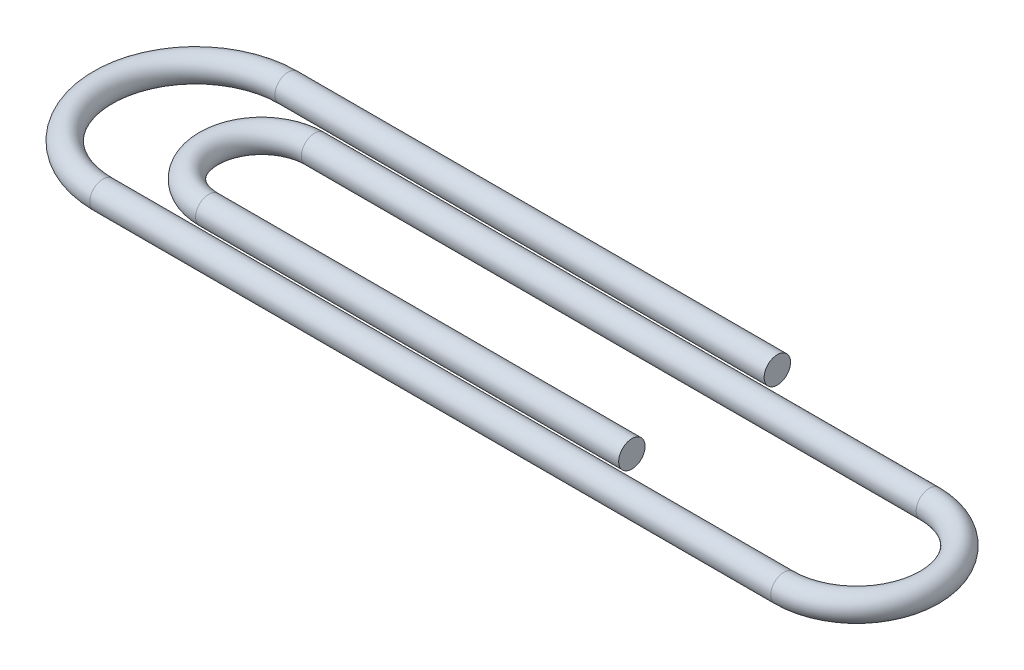
ISO-10303-21;
HEADER;
FILE_DESCRIPTION(('STEP AP214'),'2;1');
FILE_NAME('part.step','',(''),(''),'','','');
FILE_SCHEMA(('AUTOMOTIVE_DESIGN { 1 0 10303 214 1 1 1 1 }'));
ENDSEC;
DATA;
#1=APPLICATION_CONTEXT('core data for automotive mechanical design processes');
#2=APPLICATION_PROTOCOL_DEFINITION('international standard','automotive_design',2000,#1);
#3=PRODUCT_CONTEXT('',#1,'mechanical');
#4=PRODUCT('Part','Part','',(#3));
#5=PRODUCT_RELATED_PRODUCT_CATEGORY('part','',(#4));
#6=PRODUCT_DEFINITION_FORMATION('','',#4);
#7=PRODUCT_DEFINITION_CONTEXT('part definition',#1,'design');
#8=PRODUCT_DEFINITION('design','',#6,#7);
#9=PRODUCT_DEFINITION_SHAPE('','',#8);
#10=(LENGTH_UNIT() NAMED_UNIT(*) SI_UNIT(.MILLI.,.METRE.));
#11=(NAMED_UNIT(*) PLANE_ANGLE_UNIT() SI_UNIT($,.RADIAN.));
#12=(NAMED_UNIT(*) SI_UNIT($,.STERADIAN.) SOLID_ANGLE_UNIT());
#13=UNCERTAINTY_MEASURE_WITH_UNIT(LENGTH_MEASURE(1.E-05),#10,'distance_accuracy_value','');
#14=(GEOMETRIC_REPRESENTATION_CONTEXT(3) GLOBAL_UNCERTAINTY_ASSIGNED_CONTEXT((#13)) GLOBAL_UNIT_ASSIGNED_CONTEXT((#10,
#11,#12)) REPRESENTATION_CONTEXT('',''));
#15=CARTESIAN_POINT('',(0.,0.,0.));
#16=DIRECTION('',(0.,0.,1.));
#17=DIRECTION('',(1.,0.,0.));
#18=AXIS2_PLACEMENT_3D('',#15,#16,#17);
#19=CARTESIAN_POINT('',(0.,0.,0.));
#20=DIRECTION('',(1.,0.,0.));
#21=DIRECTION('',(0.,0.,-1.));
#22=AXIS2_PLACEMENT_3D('',#19,#20,#21);
#23=PLANE('',#22);
#24=CARTESIAN_POINT('',(0.,0.,0.));
#25=DIRECTION('',(1.,0.,0.));
#26=DIRECTION('',(0.,0.,-1.));
#27=AXIS2_PLACEMENT_3D('',#24,#25,#26);
#28=CIRCLE('',#27,0.5);
#29=CARTESIAN_POINT('',(0.,0.,-0.5));
#30=VERTEX_POINT('',#29);
#31=EDGE_CURVE('E72',#30,#30,#28,.T.);
#32=ORIENTED_EDGE('',*,*,#31,.T.);
#33=EDGE_LOOP('',(#32));
#34=FACE_BOUND('',#33,.T.);
#35=ADVANCED_FACE('F37',(#34),#23,.T.);
#36=CARTESIAN_POINT('',(0.,0.,-5.5));
#37=DIRECTION('',(-1.,0.,0.));
#38=DIRECTION('',(0.,0.,1.));
#39=AXIS2_PLACEMENT_3D('',#36,#37,#38);
#40=PLANE('',#39);
#41=CARTESIAN_POINT('',(0.,0.,-5.5));
#42=DIRECTION('',(-1.,0.,0.));
#43=DIRECTION('',(0.,0.,1.));
#44=AXIS2_PLACEMENT_3D('',#41,#42,#43);
#45=CIRCLE('',#44,0.5);
#46=CARTESIAN_POINT('',(0.,0.,-5.));
#47=VERTEX_POINT('',#46);
#48=EDGE_CURVE('E10',#47,#47,#45,.T.);
#49=ORIENTED_EDGE('',*,*,#48,.F.);
#50=EDGE_LOOP('',(#49));
#51=FACE_BOUND('',#50,.T.);
#52=ADVANCED_FACE('F81',(#51),#40,.F.);
#53=CARTESIAN_POINT('',(0.,0.,0.));
#54=DIRECTION('',(-1.,0.,0.));
#55=DIRECTION('',(0.,0.,1.));
#56=AXIS2_PLACEMENT_3D('',#53,#54,#55);
#57=CYLINDRICAL_SURFACE('',#56,0.5);
#58=CARTESIAN_POINT('',(-16.,0.,0.));
#59=DIRECTION('',(1.,0.,0.));
#60=DIRECTION('',(0.,0.,-1.));
#61=AXIS2_PLACEMENT_3D('',#58,#59,#60);
#62=CIRCLE('',#61,0.5);
#63=CARTESIAN_POINT('',(-16.,0.,0.500000000000002));
#64=VERTEX_POINT('',#63);
#65=EDGE_CURVE('E68',#64,#64,#62,.T.);
#66=ORIENTED_EDGE('',*,*,#65,.T.);
#67=EDGE_LOOP('',(#66));
#68=FACE_BOUND('',#67,.T.);
#69=ORIENTED_EDGE('',*,*,#31,.F.);
#70=EDGE_LOOP('',(#69));
#71=FACE_BOUND('',#70,.T.);
#72=ADVANCED_FACE('F78',(#68,#71),#57,.T.);
#73=CARTESIAN_POINT('',(-16.,0.,-2.));
#74=DIRECTION('',(0.,-1.,0.));
#75=DIRECTION('',(0.,0.,-1.));
#76=AXIS2_PLACEMENT_3D('',#73,#74,#75);
#77=TOROIDAL_SURFACE('',#76,2.,0.5);
#78=CARTESIAN_POINT('',(-16.,0.,-4.));
#79=DIRECTION('',(-1.,0.,0.));
#80=DIRECTION('',(0.,0.,1.));
#81=AXIS2_PLACEMENT_3D('',#78,#79,#80);
#82=CIRCLE('',#81,0.5);
#83=CARTESIAN_POINT('',(-16.,0.,-4.5));
#84=VERTEX_POINT('',#83);
#85=EDGE_CURVE('E64',#84,#84,#82,.T.);
#86=CARTESIAN_POINT('',(-16.,0.,-2.));
#87=DIRECTION('',(0.,-1.,0.));
#88=DIRECTION('',(0.,0.,-1.));
#89=AXIS2_PLACEMENT_3D('',#86,#87,#88);
#90=CIRCLE('',#89,2.5);
#91=EDGE_CURVE('',#64,#84,#90,.T.);
#92=ORIENTED_EDGE('',*,*,#65,.F.);
#93=ORIENTED_EDGE('',*,*,#85,.T.);
#94=ORIENTED_EDGE('',*,*,#91,.T.);
#95=ORIENTED_EDGE('',*,*,#91,.F.);
#96=EDGE_LOOP('',(#92,#94,#93,#95));
#97=FACE_BOUND('',#96,.T.);
#98=ADVANCED_FACE('F80',(#97),#77,.T.);
#99=CARTESIAN_POINT('',(-16.,0.,-4.));
#100=DIRECTION('',(1.,0.,0.));
#101=DIRECTION('',(0.,0.,-1.));
#102=AXIS2_PLACEMENT_3D('',#99,#100,#101);
#103=CYLINDRICAL_SURFACE('',#102,0.5);
#104=CARTESIAN_POINT('',(7.24999999999999,0.,-4.));
#105=DIRECTION('',(-1.,0.,0.));
#106=DIRECTION('',(0.,0.,1.));
#107=AXIS2_PLACEMENT_3D('',#104,#105,#106);
#108=CIRCLE('',#107,0.5);
#109=CARTESIAN_POINT('',(7.24999999999999,0.,-4.5));
#110=VERTEX_POINT('',#109);
#111=EDGE_CURVE('E60',#110,#110,#108,.T.);
#112=ORIENTED_EDGE('',*,*,#111,.T.);
#113=EDGE_LOOP('',(#112));
#114=FACE_BOUND('',#113,.T.);
#115=ORIENTED_EDGE('',*,*,#85,.F.);
#116=EDGE_LOOP('',(#115));
#117=FACE_BOUND('',#116,.T.);
#118=ADVANCED_FACE('F88',(#114,#117),#103,.T.);
#119=CARTESIAN_POINT('',(7.25,0.,-1.25));
#120=DIRECTION('',(0.,-1.,0.));
#121=DIRECTION('',(0.,0.,-1.));
#122=AXIS2_PLACEMENT_3D('',#119,#120,#121);
#123=TOROIDAL_SURFACE('',#122,2.74999999999999,0.5);
#124=CARTESIAN_POINT('',(7.25,0.,1.49999999999999));
#125=DIRECTION('',(1.,0.,0.));
#126=DIRECTION('',(0.,0.,-1.));
#127=AXIS2_PLACEMENT_3D('',#124,#125,#126);
#128=CIRCLE('',#127,0.5);
#129=CARTESIAN_POINT('',(7.25,0.,1.99999999999999));
#130=VERTEX_POINT('',#129);
#131=EDGE_CURVE('E54',#130,#130,#128,.T.);
#132=CARTESIAN_POINT('',(7.25,0.,-1.25));
#133=DIRECTION('',(0.,-1.,0.));
#134=DIRECTION('',(0.,0.,-1.));
#135=AXIS2_PLACEMENT_3D('',#132,#133,#134);
#136=CIRCLE('',#135,3.24999999999999);
#137=EDGE_CURVE('',#110,#130,#136,.T.);
#138=ORIENTED_EDGE('',*,*,#111,.F.);
#139=ORIENTED_EDGE('',*,*,#131,.T.);
#140=ORIENTED_EDGE('',*,*,#137,.T.);
#141=ORIENTED_EDGE('',*,*,#137,.F.);
#142=EDGE_LOOP('',(#138,#140,#139,#141));
#143=FACE_BOUND('',#142,.T.);
#144=ADVANCED_FACE('F105',(#143),#123,.T.);
#145=CARTESIAN_POINT('',(7.25,0.,1.49999999999999));
#146=DIRECTION('',(-1.,0.,0.));
#147=DIRECTION('',(0.,0.,1.));
#148=AXIS2_PLACEMENT_3D('',#145,#146,#147);
#149=CYLINDRICAL_SURFACE('',#148,0.5);
#150=CARTESIAN_POINT('',(-18.5,0.,1.5));
#151=DIRECTION('',(1.,0.,0.));
#152=DIRECTION('',(0.,0.,-1.));
#153=AXIS2_PLACEMENT_3D('',#150,#151,#152);
#154=CIRCLE('',#153,0.5);
#155=CARTESIAN_POINT('',(-18.5,0.,2.));
#156=VERTEX_POINT('',#155);
#157=EDGE_CURVE('E49',#156,#156,#154,.T.);
#158=ORIENTED_EDGE('',*,*,#157,.T.);
#159=EDGE_LOOP('',(#158));
#160=FACE_BOUND('',#159,.T.);
#161=ORIENTED_EDGE('',*,*,#131,.F.);
#162=EDGE_LOOP('',(#161));
#163=FACE_BOUND('',#162,.T.);
#164=ADVANCED_FACE('F99',(#160,#163),#149,.T.);
#165=CARTESIAN_POINT('',(-18.5,0.,-2.));
#166=DIRECTION('',(0.,-1.,0.));
#167=DIRECTION('',(0.,0.,-1.));
#168=AXIS2_PLACEMENT_3D('',#165,#166,#167);
#169=TOROIDAL_SURFACE('',#168,3.5,0.5);
#170=CARTESIAN_POINT('',(-18.5,0.,-5.5));
#171=DIRECTION('',(-1.,0.,0.));
#172=DIRECTION('',(0.,0.,1.));
#173=AXIS2_PLACEMENT_3D('',#170,#171,#172);
#174=CIRCLE('',#173,0.5);
#175=CARTESIAN_POINT('',(-18.5,0.,-6.));
#176=VERTEX_POINT('',#175);
#177=EDGE_CURVE('E44',#176,#176,#174,.T.);
#178=CARTESIAN_POINT('',(-18.5,0.,-2.));
#179=DIRECTION('',(0.,-1.,0.));
#180=DIRECTION('',(0.,0.,-1.));
#181=AXIS2_PLACEMENT_3D('',#178,#179,#180);
#182=CIRCLE('',#181,4.);
#183=EDGE_CURVE('',#156,#176,#182,.T.);
#184=ORIENTED_EDGE('',*,*,#157,.F.);
#185=ORIENTED_EDGE('',*,*,#177,.T.);
#186=ORIENTED_EDGE('',*,*,#183,.T.);
#187=ORIENTED_EDGE('',*,*,#183,.F.);
#188=EDGE_LOOP('',(#184,#186,#185,#187));
#189=FACE_BOUND('',#188,.T.);
#190=ADVANCED_FACE('F94',(#189),#169,.T.);
#191=CARTESIAN_POINT('',(-18.5,0.,-5.5));
#192=DIRECTION('',(1.,0.,0.));
#193=DIRECTION('',(0.,0.,-1.));
#194=AXIS2_PLACEMENT_3D('',#191,#192,#193);
#195=CYLINDRICAL_SURFACE('',#194,0.5);
#196=ORIENTED_EDGE('',*,*,#48,.T.);
#197=EDGE_LOOP('',(#196));
#198=FACE_BOUND('',#197,.T.);
#199=ORIENTED_EDGE('',*,*,#177,.F.);
#200=EDGE_LOOP('',(#199));
#201=FACE_BOUND('',#200,.T.);
#202=ADVANCED_FACE('F92',(#198,#201),#195,.T.);
#203=CLOSED_SHELL('',(#35,#52,#72,#98,#118,#144,#164,#190,#202));
#204=MANIFOLD_SOLID_BREP('B2',#203);
#205=ADVANCED_BREP_SHAPE_REPRESENTATION('',(#18,#204),#14);
#206=SHAPE_DEFINITION_REPRESENTATION(#9,#205);
ENDSEC;
END-ISO-10303-21;
